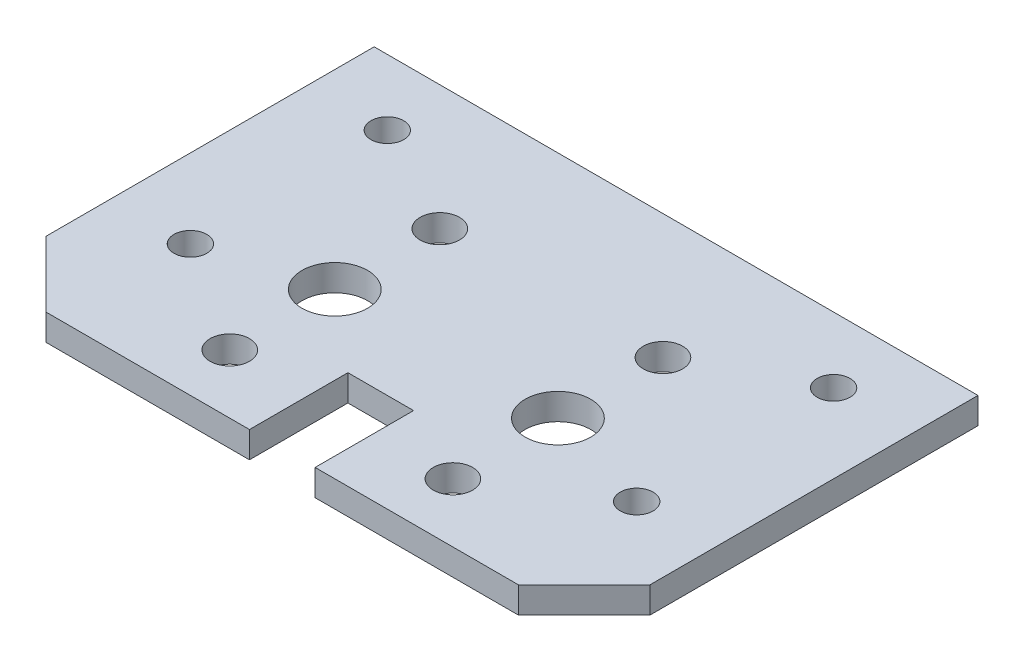
ISO-10303-21;
HEADER;
FILE_DESCRIPTION(('STEP AP214'),'2;1');
FILE_NAME('part.step','',(''),(''),'','','');
FILE_SCHEMA(('AUTOMOTIVE_DESIGN { 1 0 10303 214 1 1 1 1 }'));
ENDSEC;
DATA;
#1=APPLICATION_CONTEXT('core data for automotive mechanical design processes');
#2=APPLICATION_PROTOCOL_DEFINITION('international standard','automotive_design',2000,#1);
#3=PRODUCT_CONTEXT('',#1,'mechanical');
#4=PRODUCT('Part','Part','',(#3));
#5=PRODUCT_RELATED_PRODUCT_CATEGORY('part','',(#4));
#6=PRODUCT_DEFINITION_FORMATION('','',#4);
#7=PRODUCT_DEFINITION_CONTEXT('part definition',#1,'design');
#8=PRODUCT_DEFINITION('design','',#6,#7);
#9=PRODUCT_DEFINITION_SHAPE('','',#8);
#10=(LENGTH_UNIT() NAMED_UNIT(*) SI_UNIT(.MILLI.,.METRE.));
#11=(NAMED_UNIT(*) PLANE_ANGLE_UNIT() SI_UNIT($,.RADIAN.));
#12=(NAMED_UNIT(*) SI_UNIT($,.STERADIAN.) SOLID_ANGLE_UNIT());
#13=UNCERTAINTY_MEASURE_WITH_UNIT(LENGTH_MEASURE(1.E-05),#10,'distance_accuracy_value','');
#14=(GEOMETRIC_REPRESENTATION_CONTEXT(3) GLOBAL_UNCERTAINTY_ASSIGNED_CONTEXT((#13)) GLOBAL_UNIT_ASSIGNED_CONTEXT((#10,
#11,#12)) REPRESENTATION_CONTEXT('',''));
#15=CARTESIAN_POINT('',(0.,0.,0.));
#16=DIRECTION('',(0.,0.,1.));
#17=DIRECTION('',(1.,0.,0.));
#18=AXIS2_PLACEMENT_3D('',#15,#16,#17);
#19=CARTESIAN_POINT('',(0.,4.,0.));
#20=DIRECTION('',(0.,0.,-1.));
#21=DIRECTION('',(-1.,0.,0.));
#22=AXIS2_PLACEMENT_3D('',#19,#20,#21);
#23=PLANE('',#22);
#24=DIRECTION('',(1.,0.,0.));
#25=VECTOR('',#24,1.);
#26=CARTESIAN_POINT('',(0.,4.,0.));
#27=LINE('',#26,#25);
#28=CARTESIAN_POINT('',(10.,4.,0.));
#29=VERTEX_POINT('',#28);
#30=CARTESIAN_POINT('',(41.,4.,0.));
#31=VERTEX_POINT('',#30);
#32=EDGE_CURVE('E156',#29,#31,#27,.T.);
#33=ORIENTED_EDGE('',*,*,#32,.F.);
#34=DIRECTION('',(0.,1.,0.));
#35=VECTOR('',#34,1.);
#36=CARTESIAN_POINT('',(10.,0.,0.));
#37=LINE('',#36,#35);
#38=CARTESIAN_POINT('',(10.,0.,0.));
#39=VERTEX_POINT('',#38);
#40=EDGE_CURVE('E251',#39,#29,#37,.T.);
#41=ORIENTED_EDGE('',*,*,#40,.F.);
#42=DIRECTION('',(1.,0.,0.));
#43=VECTOR('',#42,1.);
#44=CARTESIAN_POINT('',(0.,0.,0.));
#45=LINE('',#44,#43);
#46=CARTESIAN_POINT('',(41.,0.,0.));
#47=VERTEX_POINT('',#46);
#48=EDGE_CURVE('E132',#39,#47,#45,.T.);
#49=ORIENTED_EDGE('',*,*,#48,.T.);
#50=DIRECTION('',(0.,1.,0.));
#51=VECTOR('',#50,1.);
#52=CARTESIAN_POINT('',(41.,4.,0.));
#53=LINE('',#52,#51);
#54=EDGE_CURVE('E43',#47,#31,#53,.T.);
#55=ORIENTED_EDGE('',*,*,#54,.T.);
#56=EDGE_LOOP('',(#33,#41,#49,#55));
#57=FACE_BOUND('',#56,.T.);
#58=ADVANCED_FACE('F35',(#57),#23,.F.);
#59=CARTESIAN_POINT('',(0.,4.,0.));
#60=DIRECTION('',(0.,-1.,0.));
#61=DIRECTION('',(0.,0.,-1.));
#62=AXIS2_PLACEMENT_3D('',#59,#60,#61);
#63=PLANE('',#62);
#64=CARTESIAN_POINT('',(51.,4.,0.));
#65=VERTEX_POINT('',#64);
#66=CARTESIAN_POINT('',(82.,4.,0.));
#67=VERTEX_POINT('',#66);
#68=EDGE_CURVE('E235',#65,#67,#27,.T.);
#69=ORIENTED_EDGE('',*,*,#68,.T.);
#70=DIRECTION('',(-0.707106781186547,0.,0.707106781186548));
#71=VECTOR('',#70,1.);
#72=CARTESIAN_POINT('',(92.,4.,-10.));
#73=LINE('',#72,#71);
#74=CARTESIAN_POINT('',(92.,4.,-10.));
#75=VERTEX_POINT('',#74);
#76=EDGE_CURVE('E112',#75,#67,#73,.T.);
#77=ORIENTED_EDGE('',*,*,#76,.F.);
#78=DIRECTION('',(0.,0.,-1.));
#79=VECTOR('',#78,1.);
#80=CARTESIAN_POINT('',(92.,4.,0.));
#81=LINE('',#80,#79);
#82=CARTESIAN_POINT('',(92.,4.,-60.));
#83=VERTEX_POINT('',#82);
#84=EDGE_CURVE('E237',#75,#83,#81,.T.);
#85=ORIENTED_EDGE('',*,*,#84,.T.);
#86=DIRECTION('',(-1.,0.,0.));
#87=VECTOR('',#86,1.);
#88=CARTESIAN_POINT('',(0.,4.,-60.));
#89=LINE('',#88,#87);
#90=CARTESIAN_POINT('',(0.,4.,-60.));
#91=VERTEX_POINT('',#90);
#92=EDGE_CURVE('E148',#83,#91,#89,.T.);
#93=ORIENTED_EDGE('',*,*,#92,.T.);
#94=DIRECTION('',(0.,0.,1.));
#95=VECTOR('',#94,1.);
#96=CARTESIAN_POINT('',(0.,4.,0.));
#97=LINE('',#96,#95);
#98=CARTESIAN_POINT('',(0.,4.,-10.));
#99=VERTEX_POINT('',#98);
#100=EDGE_CURVE('E143',#91,#99,#97,.T.);
#101=ORIENTED_EDGE('',*,*,#100,.T.);
#102=DIRECTION('',(-0.707106781186548,0.,-0.707106781186548));
#103=VECTOR('',#102,1.);
#104=CARTESIAN_POINT('',(10.,4.,0.));
#105=LINE('',#104,#103);
#106=EDGE_CURVE('E58',#29,#99,#105,.T.);
#107=ORIENTED_EDGE('',*,*,#106,.F.);
#108=ORIENTED_EDGE('',*,*,#32,.T.);
#109=DIRECTION('',(0.,0.,1.));
#110=VECTOR('',#109,1.);
#111=CARTESIAN_POINT('',(41.,4.,0.));
#112=LINE('',#111,#110);
#113=CARTESIAN_POINT('',(41.,4.,-15.));
#114=VERTEX_POINT('',#113);
#115=EDGE_CURVE('E165',#114,#31,#112,.T.);
#116=ORIENTED_EDGE('',*,*,#115,.F.);
#117=DIRECTION('',(-1.,0.,0.));
#118=VECTOR('',#117,1.);
#119=CARTESIAN_POINT('',(41.,4.,-15.));
#120=LINE('',#119,#118);
#121=CARTESIAN_POINT('',(51.,4.,-15.));
#122=VERTEX_POINT('',#121);
#123=EDGE_CURVE('E262',#122,#114,#120,.T.);
#124=ORIENTED_EDGE('',*,*,#123,.F.);
#125=DIRECTION('',(0.,0.,-1.));
#126=VECTOR('',#125,1.);
#127=CARTESIAN_POINT('',(51.,4.,0.));
#128=LINE('',#127,#126);
#129=EDGE_CURVE('E253',#65,#122,#128,.T.);
#130=ORIENTED_EDGE('',*,*,#129,.F.);
#131=EDGE_LOOP('',(#69,#77,#85,#93,#101,#107,#108,#116,#124,#130));
#132=FACE_BOUND('',#131,.T.);
#133=CARTESIAN_POINT('',(12.,4.,-50.));
#134=DIRECTION('',(0.,1.,0.));
#135=DIRECTION('',(0.,0.,1.));
#136=AXIS2_PLACEMENT_3D('',#133,#134,#135);
#137=CIRCLE('',#136,2.5);
#138=CARTESIAN_POINT('',(12.,4.,-47.5));
#139=VERTEX_POINT('',#138);
#140=EDGE_CURVE('E136',#139,#139,#137,.T.);
#141=ORIENTED_EDGE('',*,*,#140,.F.);
#142=EDGE_LOOP('',(#141));
#143=FACE_BOUND('',#142,.T.);
#144=CARTESIAN_POINT('',(12.,4.,-20.));
#145=DIRECTION('',(0.,1.,0.));
#146=DIRECTION('',(0.,0.,1.));
#147=AXIS2_PLACEMENT_3D('',#144,#145,#146);
#148=CIRCLE('',#147,2.5);
#149=CARTESIAN_POINT('',(12.,4.,-17.5));
#150=VERTEX_POINT('',#149);
#151=EDGE_CURVE('E223',#150,#150,#148,.T.);
#152=ORIENTED_EDGE('',*,*,#151,.F.);
#153=EDGE_LOOP('',(#152));
#154=FACE_BOUND('',#153,.T.);
#155=CARTESIAN_POINT('',(80.,4.,-50.));
#156=DIRECTION('',(0.,1.,0.));
#157=DIRECTION('',(0.,0.,1.));
#158=AXIS2_PLACEMENT_3D('',#155,#156,#157);
#159=CIRCLE('',#158,2.50000000000001);
#160=CARTESIAN_POINT('',(80.,4.,-47.5));
#161=VERTEX_POINT('',#160);
#162=EDGE_CURVE('E217',#161,#161,#159,.T.);
#163=ORIENTED_EDGE('',*,*,#162,.F.);
#164=EDGE_LOOP('',(#163));
#165=FACE_BOUND('',#164,.T.);
#166=CARTESIAN_POINT('',(29.,4.,-25.));
#167=DIRECTION('',(0.,1.,0.));
#168=DIRECTION('',(0.,0.,1.));
#169=AXIS2_PLACEMENT_3D('',#166,#167,#168);
#170=CIRCLE('',#169,4.99999999999999);
#171=CARTESIAN_POINT('',(29.,4.,-20.));
#172=VERTEX_POINT('',#171);
#173=EDGE_CURVE('E211',#172,#172,#170,.T.);
#174=ORIENTED_EDGE('',*,*,#173,.F.);
#175=EDGE_LOOP('',(#174));
#176=FACE_BOUND('',#175,.T.);
#177=CARTESIAN_POINT('',(63.,4.,-25.));
#178=DIRECTION('',(0.,1.,0.));
#179=DIRECTION('',(0.,0.,1.));
#180=AXIS2_PLACEMENT_3D('',#177,#178,#179);
#181=CIRCLE('',#180,5.);
#182=CARTESIAN_POINT('',(63.,4.,-20.));
#183=VERTEX_POINT('',#182);
#184=EDGE_CURVE('E205',#183,#183,#181,.T.);
#185=ORIENTED_EDGE('',*,*,#184,.F.);
#186=EDGE_LOOP('',(#185));
#187=FACE_BOUND('',#186,.T.);
#188=CARTESIAN_POINT('',(80.,4.,-20.));
#189=DIRECTION('',(0.,1.,0.));
#190=DIRECTION('',(0.,0.,1.));
#191=AXIS2_PLACEMENT_3D('',#188,#189,#190);
#192=CIRCLE('',#191,2.49999999999999);
#193=CARTESIAN_POINT('',(80.,4.,-17.5));
#194=VERTEX_POINT('',#193);
#195=EDGE_CURVE('E199',#194,#194,#192,.T.);
#196=ORIENTED_EDGE('',*,*,#195,.F.);
#197=EDGE_LOOP('',(#196));
#198=FACE_BOUND('',#197,.T.);
#199=CARTESIAN_POINT('',(29.,4.,-41.));
#200=DIRECTION('',(0.,1.,0.));
#201=DIRECTION('',(0.,0.,1.));
#202=AXIS2_PLACEMENT_3D('',#199,#200,#201);
#203=CIRCLE('',#202,3.);
#204=CARTESIAN_POINT('',(29.,4.,-38.));
#205=VERTEX_POINT('',#204);
#206=EDGE_CURVE('E193',#205,#205,#203,.T.);
#207=ORIENTED_EDGE('',*,*,#206,.F.);
#208=EDGE_LOOP('',(#207));
#209=FACE_BOUND('',#208,.T.);
#210=CARTESIAN_POINT('',(29.,4.,-8.99999999999999));
#211=DIRECTION('',(0.,1.,0.));
#212=DIRECTION('',(0.,0.,1.));
#213=AXIS2_PLACEMENT_3D('',#210,#211,#212);
#214=CIRCLE('',#213,3.);
#215=CARTESIAN_POINT('',(29.,4.,-5.99999999999999));
#216=VERTEX_POINT('',#215);
#217=EDGE_CURVE('E187',#216,#216,#214,.T.);
#218=ORIENTED_EDGE('',*,*,#217,.F.);
#219=EDGE_LOOP('',(#218));
#220=FACE_BOUND('',#219,.T.);
#221=CARTESIAN_POINT('',(63.,4.,-41.));
#222=DIRECTION('',(0.,1.,0.));
#223=DIRECTION('',(0.,0.,1.));
#224=AXIS2_PLACEMENT_3D('',#221,#222,#223);
#225=CIRCLE('',#224,3.00000000000001);
#226=CARTESIAN_POINT('',(63.,4.,-38.));
#227=VERTEX_POINT('',#226);
#228=EDGE_CURVE('E181',#227,#227,#225,.T.);
#229=ORIENTED_EDGE('',*,*,#228,.F.);
#230=EDGE_LOOP('',(#229));
#231=FACE_BOUND('',#230,.T.);
#232=CARTESIAN_POINT('',(63.,4.,-8.99999999999999));
#233=DIRECTION('',(0.,1.,0.));
#234=DIRECTION('',(0.,0.,1.));
#235=AXIS2_PLACEMENT_3D('',#232,#233,#234);
#236=CIRCLE('',#235,3.00000000000001);
#237=CARTESIAN_POINT('',(63.,4.,-5.99999999999999));
#238=VERTEX_POINT('',#237);
#239=EDGE_CURVE('E172',#238,#238,#236,.T.);
#240=ORIENTED_EDGE('',*,*,#239,.F.);
#241=EDGE_LOOP('',(#240));
#242=FACE_BOUND('',#241,.T.);
#243=ADVANCED_FACE('F241',(#132,#143,#154,#165,#176,#187,#198,#209,#220,#231,#242),#63,.F.);
#244=CARTESIAN_POINT('',(0.,0.,0.));
#245=DIRECTION('',(0.,-1.,0.));
#246=DIRECTION('',(0.,0.,-1.));
#247=AXIS2_PLACEMENT_3D('',#244,#245,#246);
#248=PLANE('',#247);
#249=DIRECTION('',(-0.707106781186547,0.,0.707106781186548));
#250=VECTOR('',#249,1.);
#251=CARTESIAN_POINT('',(92.,0.,-10.));
#252=LINE('',#251,#250);
#253=CARTESIAN_POINT('',(92.,0.,-10.));
#254=VERTEX_POINT('',#253);
#255=CARTESIAN_POINT('',(82.,0.,0.));
#256=VERTEX_POINT('',#255);
#257=EDGE_CURVE('E50',#254,#256,#252,.T.);
#258=ORIENTED_EDGE('',*,*,#257,.T.);
#259=CARTESIAN_POINT('',(51.,0.,0.));
#260=VERTEX_POINT('',#259);
#261=EDGE_CURVE('E125',#260,#256,#45,.T.);
#262=ORIENTED_EDGE('',*,*,#261,.F.);
#263=DIRECTION('',(0.,0.,1.));
#264=VECTOR('',#263,1.);
#265=CARTESIAN_POINT('',(51.,0.,0.));
#266=LINE('',#265,#264);
#267=CARTESIAN_POINT('',(51.,0.,-15.));
#268=VERTEX_POINT('',#267);
#269=EDGE_CURVE('E169',#268,#260,#266,.T.);
#270=ORIENTED_EDGE('',*,*,#269,.F.);
#271=DIRECTION('',(1.,0.,0.));
#272=VECTOR('',#271,1.);
#273=CARTESIAN_POINT('',(0.,0.,-15.));
#274=LINE('',#273,#272);
#275=CARTESIAN_POINT('',(41.,0.,-15.));
#276=VERTEX_POINT('',#275);
#277=EDGE_CURVE('E11',#276,#268,#274,.T.);
#278=ORIENTED_EDGE('',*,*,#277,.F.);
#279=DIRECTION('',(0.,0.,-1.));
#280=VECTOR('',#279,1.);
#281=CARTESIAN_POINT('',(41.,0.,0.));
#282=LINE('',#281,#280);
#283=EDGE_CURVE('E162',#47,#276,#282,.T.);
#284=ORIENTED_EDGE('',*,*,#283,.F.);
#285=ORIENTED_EDGE('',*,*,#48,.F.);
#286=DIRECTION('',(-0.707106781186548,0.,-0.707106781186548));
#287=VECTOR('',#286,1.);
#288=CARTESIAN_POINT('',(10.,0.,0.));
#289=LINE('',#288,#287);
#290=CARTESIAN_POINT('',(0.,0.,-10.));
#291=VERTEX_POINT('',#290);
#292=EDGE_CURVE('E255',#39,#291,#289,.T.);
#293=ORIENTED_EDGE('',*,*,#292,.T.);
#294=DIRECTION('',(0.,0.,1.));
#295=VECTOR('',#294,1.);
#296=CARTESIAN_POINT('',(0.,0.,0.));
#297=LINE('',#296,#295);
#298=CARTESIAN_POINT('',(0.,0.,-60.));
#299=VERTEX_POINT('',#298);
#300=EDGE_CURVE('E133',#299,#291,#297,.T.);
#301=ORIENTED_EDGE('',*,*,#300,.F.);
#302=DIRECTION('',(-1.,0.,0.));
#303=VECTOR('',#302,1.);
#304=CARTESIAN_POINT('',(0.,0.,-60.));
#305=LINE('',#304,#303);
#306=CARTESIAN_POINT('',(92.,0.,-60.));
#307=VERTEX_POINT('',#306);
#308=EDGE_CURVE('E141',#307,#299,#305,.T.);
#309=ORIENTED_EDGE('',*,*,#308,.F.);
#310=DIRECTION('',(0.,0.,-1.));
#311=VECTOR('',#310,1.);
#312=CARTESIAN_POINT('',(92.,0.,0.));
#313=LINE('',#312,#311);
#314=EDGE_CURVE('E127',#254,#307,#313,.T.);
#315=ORIENTED_EDGE('',*,*,#314,.F.);
#316=EDGE_LOOP('',(#258,#262,#270,#278,#284,#285,#293,#301,#309,#315));
#317=FACE_BOUND('',#316,.T.);
#318=CARTESIAN_POINT('',(63.,0.,-41.));
#319=DIRECTION('',(0.,1.,0.));
#320=DIRECTION('',(0.,0.,1.));
#321=AXIS2_PLACEMENT_3D('',#318,#319,#320);
#322=CIRCLE('',#321,3.00000000000001);
#323=CARTESIAN_POINT('',(63.,0.,-38.));
#324=VERTEX_POINT('',#323);
#325=EDGE_CURVE('E179',#324,#324,#322,.T.);
#326=ORIENTED_EDGE('',*,*,#325,.T.);
#327=EDGE_LOOP('',(#326));
#328=FACE_BOUND('',#327,.T.);
#329=CARTESIAN_POINT('',(29.,0.,-41.));
#330=DIRECTION('',(0.,1.,0.));
#331=DIRECTION('',(0.,0.,1.));
#332=AXIS2_PLACEMENT_3D('',#329,#330,#331);
#333=CIRCLE('',#332,3.);
#334=CARTESIAN_POINT('',(29.,0.,-38.));
#335=VERTEX_POINT('',#334);
#336=EDGE_CURVE('E190',#335,#335,#333,.T.);
#337=ORIENTED_EDGE('',*,*,#336,.T.);
#338=EDGE_LOOP('',(#337));
#339=FACE_BOUND('',#338,.T.);
#340=CARTESIAN_POINT('',(63.,0.,-25.));
#341=DIRECTION('',(0.,1.,0.));
#342=DIRECTION('',(0.,0.,1.));
#343=AXIS2_PLACEMENT_3D('',#340,#341,#342);
#344=CIRCLE('',#343,5.);
#345=CARTESIAN_POINT('',(63.,0.,-20.));
#346=VERTEX_POINT('',#345);
#347=EDGE_CURVE('E202',#346,#346,#344,.T.);
#348=ORIENTED_EDGE('',*,*,#347,.T.);
#349=EDGE_LOOP('',(#348));
#350=FACE_BOUND('',#349,.T.);
#351=CARTESIAN_POINT('',(80.,0.,-50.));
#352=DIRECTION('',(0.,1.,0.));
#353=DIRECTION('',(0.,0.,1.));
#354=AXIS2_PLACEMENT_3D('',#351,#352,#353);
#355=CIRCLE('',#354,2.50000000000001);
#356=CARTESIAN_POINT('',(80.,0.,-47.5));
#357=VERTEX_POINT('',#356);
#358=EDGE_CURVE('E214',#357,#357,#355,.T.);
#359=ORIENTED_EDGE('',*,*,#358,.T.);
#360=EDGE_LOOP('',(#359));
#361=FACE_BOUND('',#360,.T.);
#362=CARTESIAN_POINT('',(12.,0.,-50.));
#363=DIRECTION('',(0.,1.,0.));
#364=DIRECTION('',(0.,0.,1.));
#365=AXIS2_PLACEMENT_3D('',#362,#363,#364);
#366=CIRCLE('',#365,2.5);
#367=CARTESIAN_POINT('',(12.,0.,-47.5));
#368=VERTEX_POINT('',#367);
#369=EDGE_CURVE('E226',#368,#368,#366,.T.);
#370=ORIENTED_EDGE('',*,*,#369,.T.);
#371=EDGE_LOOP('',(#370));
#372=FACE_BOUND('',#371,.T.);
#373=CARTESIAN_POINT('',(12.,0.,-20.));
#374=DIRECTION('',(0.,1.,0.));
#375=DIRECTION('',(0.,0.,1.));
#376=AXIS2_PLACEMENT_3D('',#373,#374,#375);
#377=CIRCLE('',#376,2.5);
#378=CARTESIAN_POINT('',(12.,0.,-17.5));
#379=VERTEX_POINT('',#378);
#380=EDGE_CURVE('E220',#379,#379,#377,.T.);
#381=ORIENTED_EDGE('',*,*,#380,.T.);
#382=EDGE_LOOP('',(#381));
#383=FACE_BOUND('',#382,.T.);
#384=CARTESIAN_POINT('',(29.,0.,-25.));
#385=DIRECTION('',(0.,1.,0.));
#386=DIRECTION('',(0.,0.,1.));
#387=AXIS2_PLACEMENT_3D('',#384,#385,#386);
#388=CIRCLE('',#387,4.99999999999999);
#389=CARTESIAN_POINT('',(29.,0.,-20.));
#390=VERTEX_POINT('',#389);
#391=EDGE_CURVE('E208',#390,#390,#388,.T.);
#392=ORIENTED_EDGE('',*,*,#391,.T.);
#393=EDGE_LOOP('',(#392));
#394=FACE_BOUND('',#393,.T.);
#395=CARTESIAN_POINT('',(80.,0.,-20.));
#396=DIRECTION('',(0.,1.,0.));
#397=DIRECTION('',(0.,0.,1.));
#398=AXIS2_PLACEMENT_3D('',#395,#396,#397);
#399=CIRCLE('',#398,2.49999999999999);
#400=CARTESIAN_POINT('',(80.,0.,-17.5));
#401=VERTEX_POINT('',#400);
#402=EDGE_CURVE('E196',#401,#401,#399,.T.);
#403=ORIENTED_EDGE('',*,*,#402,.T.);
#404=EDGE_LOOP('',(#403));
#405=FACE_BOUND('',#404,.T.);
#406=CARTESIAN_POINT('',(29.,0.,-8.99999999999999));
#407=DIRECTION('',(0.,1.,0.));
#408=DIRECTION('',(0.,0.,1.));
#409=AXIS2_PLACEMENT_3D('',#406,#407,#408);
#410=CIRCLE('',#409,3.);
#411=CARTESIAN_POINT('',(29.,0.,-5.99999999999999));
#412=VERTEX_POINT('',#411);
#413=EDGE_CURVE('E184',#412,#412,#410,.T.);
#414=ORIENTED_EDGE('',*,*,#413,.T.);
#415=EDGE_LOOP('',(#414));
#416=FACE_BOUND('',#415,.T.);
#417=CARTESIAN_POINT('',(63.,0.,-8.99999999999999));
#418=DIRECTION('',(0.,1.,0.));
#419=DIRECTION('',(0.,0.,1.));
#420=AXIS2_PLACEMENT_3D('',#417,#418,#419);
#421=CIRCLE('',#420,3.00000000000001);
#422=CARTESIAN_POINT('',(63.,0.,-5.99999999999999));
#423=VERTEX_POINT('',#422);
#424=EDGE_CURVE('E168',#423,#423,#421,.T.);
#425=ORIENTED_EDGE('',*,*,#424,.T.);
#426=EDGE_LOOP('',(#425));
#427=FACE_BOUND('',#426,.T.);
#428=ADVANCED_FACE('F122',(#317,#328,#339,#350,#361,#372,#383,#394,#405,#416,#427),#248,.T.);
#429=CARTESIAN_POINT('',(0.,4.,0.));
#430=DIRECTION('',(1.,0.,0.));
#431=DIRECTION('',(0.,0.,-1.));
#432=AXIS2_PLACEMENT_3D('',#429,#430,#431);
#433=PLANE('',#432);
#434=ORIENTED_EDGE('',*,*,#300,.T.);
#435=DIRECTION('',(0.,1.,0.));
#436=VECTOR('',#435,1.);
#437=CARTESIAN_POINT('',(0.,0.,-10.));
#438=LINE('',#437,#436);
#439=EDGE_CURVE('E250',#291,#99,#438,.T.);
#440=ORIENTED_EDGE('',*,*,#439,.T.);
#441=ORIENTED_EDGE('',*,*,#100,.F.);
#442=DIRECTION('',(0.,-1.,0.));
#443=VECTOR('',#442,1.);
#444=CARTESIAN_POINT('',(0.,4.,-60.));
#445=LINE('',#444,#443);
#446=EDGE_CURVE('E144',#91,#299,#445,.T.);
#447=ORIENTED_EDGE('',*,*,#446,.T.);
#448=EDGE_LOOP('',(#434,#440,#441,#447));
#449=FACE_BOUND('',#448,.T.);
#450=ADVANCED_FACE('F37',(#449),#433,.F.);
#451=ORIENTED_EDGE('',*,*,#261,.T.);
#452=DIRECTION('',(0.,1.,0.));
#453=VECTOR('',#452,1.);
#454=CARTESIAN_POINT('',(82.,0.,0.));
#455=LINE('',#454,#453);
#456=EDGE_CURVE('E109',#256,#67,#455,.T.);
#457=ORIENTED_EDGE('',*,*,#456,.T.);
#458=ORIENTED_EDGE('',*,*,#68,.F.);
#459=DIRECTION('',(0.,-1.,0.));
#460=VECTOR('',#459,1.);
#461=CARTESIAN_POINT('',(51.,4.,0.));
#462=LINE('',#461,#460);
#463=EDGE_CURVE('E131',#65,#260,#462,.T.);
#464=ORIENTED_EDGE('',*,*,#463,.T.);
#465=EDGE_LOOP('',(#451,#457,#458,#464));
#466=FACE_BOUND('',#465,.T.);
#467=ADVANCED_FACE('F130',(#466),#23,.F.);
#468=CARTESIAN_POINT('',(92.,4.,0.));
#469=DIRECTION('',(-1.,0.,0.));
#470=DIRECTION('',(0.,0.,1.));
#471=AXIS2_PLACEMENT_3D('',#468,#469,#470);
#472=PLANE('',#471);
#473=ORIENTED_EDGE('',*,*,#84,.F.);
#474=DIRECTION('',(0.,1.,0.));
#475=VECTOR('',#474,1.);
#476=CARTESIAN_POINT('',(92.,0.,-10.));
#477=LINE('',#476,#475);
#478=EDGE_CURVE('E117',#254,#75,#477,.T.);
#479=ORIENTED_EDGE('',*,*,#478,.F.);
#480=ORIENTED_EDGE('',*,*,#314,.T.);
#481=DIRECTION('',(0.,-1.,0.));
#482=VECTOR('',#481,1.);
#483=CARTESIAN_POINT('',(92.,4.,-60.));
#484=LINE('',#483,#482);
#485=EDGE_CURVE('E147',#83,#307,#484,.T.);
#486=ORIENTED_EDGE('',*,*,#485,.F.);
#487=EDGE_LOOP('',(#473,#479,#480,#486));
#488=FACE_BOUND('',#487,.T.);
#489=ADVANCED_FACE('F276',(#488),#472,.F.);
#490=CARTESIAN_POINT('',(0.,4.,-60.));
#491=DIRECTION('',(0.,0.,1.));
#492=DIRECTION('',(1.,0.,0.));
#493=AXIS2_PLACEMENT_3D('',#490,#491,#492);
#494=PLANE('',#493);
#495=ORIENTED_EDGE('',*,*,#308,.T.);
#496=ORIENTED_EDGE('',*,*,#446,.F.);
#497=ORIENTED_EDGE('',*,*,#92,.F.);
#498=ORIENTED_EDGE('',*,*,#485,.T.);
#499=EDGE_LOOP('',(#495,#496,#497,#498));
#500=FACE_BOUND('',#499,.T.);
#501=ADVANCED_FACE('F247',(#500),#494,.F.);
#502=CARTESIAN_POINT('',(12.,4.,-50.));
#503=DIRECTION('',(0.,-1.,0.));
#504=DIRECTION('',(0.,0.,-1.));
#505=AXIS2_PLACEMENT_3D('',#502,#503,#504);
#506=CYLINDRICAL_SURFACE('',#505,2.5);
#507=ORIENTED_EDGE('',*,*,#140,.T.);
#508=EDGE_LOOP('',(#507));
#509=FACE_BOUND('',#508,.T.);
#510=ORIENTED_EDGE('',*,*,#369,.F.);
#511=EDGE_LOOP('',(#510));
#512=FACE_BOUND('',#511,.T.);
#513=ADVANCED_FACE('F284',(#509,#512),#506,.F.);
#514=CARTESIAN_POINT('',(12.,4.,-20.));
#515=DIRECTION('',(0.,-1.,0.));
#516=DIRECTION('',(0.,0.,-1.));
#517=AXIS2_PLACEMENT_3D('',#514,#515,#516);
#518=CYLINDRICAL_SURFACE('',#517,2.5);
#519=ORIENTED_EDGE('',*,*,#151,.T.);
#520=EDGE_LOOP('',(#519));
#521=FACE_BOUND('',#520,.T.);
#522=ORIENTED_EDGE('',*,*,#380,.F.);
#523=EDGE_LOOP('',(#522));
#524=FACE_BOUND('',#523,.T.);
#525=ADVANCED_FACE('F299',(#521,#524),#518,.F.);
#526=CARTESIAN_POINT('',(80.,4.,-50.));
#527=DIRECTION('',(0.,-1.,0.));
#528=DIRECTION('',(0.,0.,-1.));
#529=AXIS2_PLACEMENT_3D('',#526,#527,#528);
#530=CYLINDRICAL_SURFACE('',#529,2.50000000000001);
#531=ORIENTED_EDGE('',*,*,#162,.T.);
#532=EDGE_LOOP('',(#531));
#533=FACE_BOUND('',#532,.T.);
#534=ORIENTED_EDGE('',*,*,#358,.F.);
#535=EDGE_LOOP('',(#534));
#536=FACE_BOUND('',#535,.T.);
#537=ADVANCED_FACE('F303',(#533,#536),#530,.F.);
#538=CARTESIAN_POINT('',(29.,4.,-25.));
#539=DIRECTION('',(0.,-1.,0.));
#540=DIRECTION('',(0.,0.,-1.));
#541=AXIS2_PLACEMENT_3D('',#538,#539,#540);
#542=CYLINDRICAL_SURFACE('',#541,4.99999999999999);
#543=ORIENTED_EDGE('',*,*,#173,.T.);
#544=EDGE_LOOP('',(#543));
#545=FACE_BOUND('',#544,.T.);
#546=ORIENTED_EDGE('',*,*,#391,.F.);
#547=EDGE_LOOP('',(#546));
#548=FACE_BOUND('',#547,.T.);
#549=ADVANCED_FACE('F307',(#545,#548),#542,.F.);
#550=CARTESIAN_POINT('',(63.,4.,-25.));
#551=DIRECTION('',(0.,-1.,0.));
#552=DIRECTION('',(0.,0.,-1.));
#553=AXIS2_PLACEMENT_3D('',#550,#551,#552);
#554=CYLINDRICAL_SURFACE('',#553,5.);
#555=ORIENTED_EDGE('',*,*,#184,.T.);
#556=EDGE_LOOP('',(#555));
#557=FACE_BOUND('',#556,.T.);
#558=ORIENTED_EDGE('',*,*,#347,.F.);
#559=EDGE_LOOP('',(#558));
#560=FACE_BOUND('',#559,.T.);
#561=ADVANCED_FACE('F311',(#557,#560),#554,.F.);
#562=CARTESIAN_POINT('',(80.,4.,-20.));
#563=DIRECTION('',(0.,-1.,0.));
#564=DIRECTION('',(0.,0.,-1.));
#565=AXIS2_PLACEMENT_3D('',#562,#563,#564);
#566=CYLINDRICAL_SURFACE('',#565,2.49999999999999);
#567=ORIENTED_EDGE('',*,*,#195,.T.);
#568=EDGE_LOOP('',(#567));
#569=FACE_BOUND('',#568,.T.);
#570=ORIENTED_EDGE('',*,*,#402,.F.);
#571=EDGE_LOOP('',(#570));
#572=FACE_BOUND('',#571,.T.);
#573=ADVANCED_FACE('F315',(#569,#572),#566,.F.);
#574=CARTESIAN_POINT('',(29.,4.,-41.));
#575=DIRECTION('',(0.,-1.,0.));
#576=DIRECTION('',(0.,0.,-1.));
#577=AXIS2_PLACEMENT_3D('',#574,#575,#576);
#578=CYLINDRICAL_SURFACE('',#577,3.);
#579=ORIENTED_EDGE('',*,*,#206,.T.);
#580=EDGE_LOOP('',(#579));
#581=FACE_BOUND('',#580,.T.);
#582=ORIENTED_EDGE('',*,*,#336,.F.);
#583=EDGE_LOOP('',(#582));
#584=FACE_BOUND('',#583,.T.);
#585=ADVANCED_FACE('F319',(#581,#584),#578,.F.);
#586=CARTESIAN_POINT('',(29.,4.,-8.99999999999999));
#587=DIRECTION('',(0.,-1.,0.));
#588=DIRECTION('',(0.,0.,-1.));
#589=AXIS2_PLACEMENT_3D('',#586,#587,#588);
#590=CYLINDRICAL_SURFACE('',#589,3.);
#591=ORIENTED_EDGE('',*,*,#217,.T.);
#592=EDGE_LOOP('',(#591));
#593=FACE_BOUND('',#592,.T.);
#594=ORIENTED_EDGE('',*,*,#413,.F.);
#595=EDGE_LOOP('',(#594));
#596=FACE_BOUND('',#595,.T.);
#597=ADVANCED_FACE('F323',(#593,#596),#590,.F.);
#598=CARTESIAN_POINT('',(63.,4.,-41.));
#599=DIRECTION('',(0.,-1.,0.));
#600=DIRECTION('',(0.,0.,-1.));
#601=AXIS2_PLACEMENT_3D('',#598,#599,#600);
#602=CYLINDRICAL_SURFACE('',#601,3.00000000000001);
#603=ORIENTED_EDGE('',*,*,#228,.T.);
#604=EDGE_LOOP('',(#603));
#605=FACE_BOUND('',#604,.T.);
#606=ORIENTED_EDGE('',*,*,#325,.F.);
#607=EDGE_LOOP('',(#606));
#608=FACE_BOUND('',#607,.T.);
#609=ADVANCED_FACE('F327',(#605,#608),#602,.F.);
#610=CARTESIAN_POINT('',(63.,4.,-8.99999999999999));
#611=DIRECTION('',(0.,-1.,0.));
#612=DIRECTION('',(0.,0.,-1.));
#613=AXIS2_PLACEMENT_3D('',#610,#611,#612);
#614=CYLINDRICAL_SURFACE('',#613,3.00000000000001);
#615=ORIENTED_EDGE('',*,*,#239,.T.);
#616=EDGE_LOOP('',(#615));
#617=FACE_BOUND('',#616,.T.);
#618=ORIENTED_EDGE('',*,*,#424,.F.);
#619=EDGE_LOOP('',(#618));
#620=FACE_BOUND('',#619,.T.);
#621=ADVANCED_FACE('F331',(#617,#620),#614,.F.);
#622=CARTESIAN_POINT('',(41.,-6.,0.));
#623=DIRECTION('',(-1.,0.,0.));
#624=DIRECTION('',(0.,0.,1.));
#625=AXIS2_PLACEMENT_3D('',#622,#623,#624);
#626=PLANE('',#625);
#627=ORIENTED_EDGE('',*,*,#283,.T.);
#628=DIRECTION('',(0.,1.,0.));
#629=VECTOR('',#628,1.);
#630=CARTESIAN_POINT('',(41.,-6.,-15.));
#631=LINE('',#630,#629);
#632=EDGE_CURVE('E174',#276,#114,#631,.T.);
#633=ORIENTED_EDGE('',*,*,#632,.T.);
#634=ORIENTED_EDGE('',*,*,#115,.T.);
#635=ORIENTED_EDGE('',*,*,#54,.F.);
#636=EDGE_LOOP('',(#627,#633,#634,#635));
#637=FACE_BOUND('',#636,.T.);
#638=ADVANCED_FACE('F161',(#637),#626,.F.);
#639=CARTESIAN_POINT('',(41.,-6.,-15.));
#640=DIRECTION('',(0.,0.,-1.));
#641=DIRECTION('',(-1.,0.,0.));
#642=AXIS2_PLACEMENT_3D('',#639,#640,#641);
#643=PLANE('',#642);
#644=ORIENTED_EDGE('',*,*,#277,.T.);
#645=DIRECTION('',(0.,1.,0.));
#646=VECTOR('',#645,1.);
#647=CARTESIAN_POINT('',(51.,-6.,-15.));
#648=LINE('',#647,#646);
#649=EDGE_CURVE('E265',#268,#122,#648,.T.);
#650=ORIENTED_EDGE('',*,*,#649,.T.);
#651=ORIENTED_EDGE('',*,*,#123,.T.);
#652=ORIENTED_EDGE('',*,*,#632,.F.);
#653=EDGE_LOOP('',(#644,#650,#651,#652));
#654=FACE_BOUND('',#653,.T.);
#655=ADVANCED_FACE('F268',(#654),#643,.F.);
#656=CARTESIAN_POINT('',(51.,-6.,0.));
#657=DIRECTION('',(1.,0.,0.));
#658=DIRECTION('',(0.,0.,-1.));
#659=AXIS2_PLACEMENT_3D('',#656,#657,#658);
#660=PLANE('',#659);
#661=ORIENTED_EDGE('',*,*,#269,.T.);
#662=ORIENTED_EDGE('',*,*,#463,.F.);
#663=ORIENTED_EDGE('',*,*,#129,.T.);
#664=ORIENTED_EDGE('',*,*,#649,.F.);
#665=EDGE_LOOP('',(#661,#662,#663,#664));
#666=FACE_BOUND('',#665,.T.);
#667=ADVANCED_FACE('F272',(#666),#660,.F.);
#668=CARTESIAN_POINT('',(10.,0.,0.));
#669=DIRECTION('',(0.707106781186547,0.,-0.707106781186547));
#670=DIRECTION('',(-0.707106781186548,0.,-0.707106781186548));
#671=AXIS2_PLACEMENT_3D('',#668,#669,#670);
#672=PLANE('',#671);
#673=ORIENTED_EDGE('',*,*,#106,.T.);
#674=ORIENTED_EDGE('',*,*,#439,.F.);
#675=ORIENTED_EDGE('',*,*,#292,.F.);
#676=ORIENTED_EDGE('',*,*,#40,.T.);
#677=EDGE_LOOP('',(#673,#674,#675,#676));
#678=FACE_BOUND('',#677,.T.);
#679=ADVANCED_FACE('F340',(#678),#672,.F.);
#680=CARTESIAN_POINT('',(92.,0.,-10.));
#681=DIRECTION('',(-0.707106781186548,0.,-0.707106781186547));
#682=DIRECTION('',(-0.707106781186547,0.,0.707106781186548));
#683=AXIS2_PLACEMENT_3D('',#680,#681,#682);
#684=PLANE('',#683);
#685=ORIENTED_EDGE('',*,*,#76,.T.);
#686=ORIENTED_EDGE('',*,*,#456,.F.);
#687=ORIENTED_EDGE('',*,*,#257,.F.);
#688=ORIENTED_EDGE('',*,*,#478,.T.);
#689=EDGE_LOOP('',(#685,#686,#687,#688));
#690=FACE_BOUND('',#689,.T.);
#691=ADVANCED_FACE('F110',(#690),#684,.F.);
#692=CLOSED_SHELL('',(#58,#243,#428,#450,#467,#489,#501,#513,#525,#537,#549,#561,#573,#585,#597,
#609,#621,#638,#655,#667,#679,#691));
#693=MANIFOLD_SOLID_BREP('B2',#692);
#694=ADVANCED_BREP_SHAPE_REPRESENTATION('',(#18,#693),#14);
#695=SHAPE_DEFINITION_REPRESENTATION(#9,#694);
ENDSEC;
END-ISO-10303-21;
